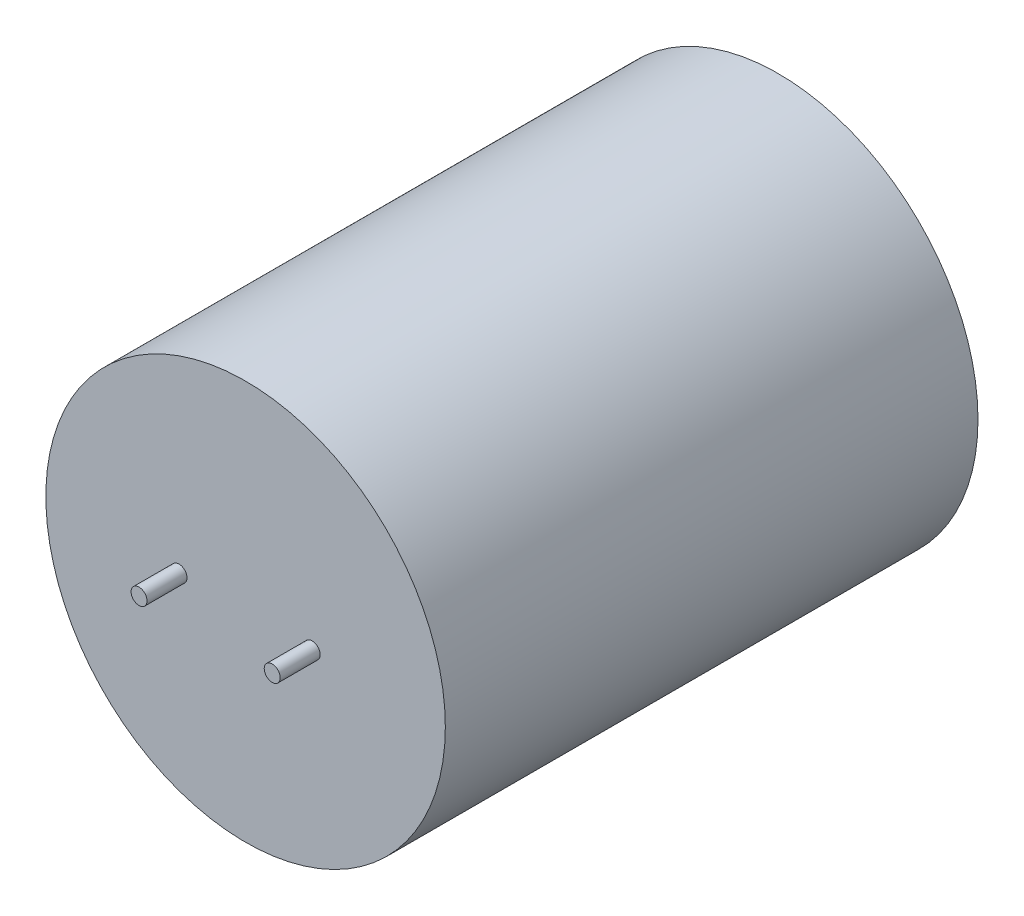
ISO-10303-21;
HEADER;
FILE_DESCRIPTION(('STEP AP214'),'2;1');
FILE_NAME('part.step','',(''),(''),'','','');
FILE_SCHEMA(('AUTOMOTIVE_DESIGN { 1 0 10303 214 1 1 1 1 }'));
ENDSEC;
DATA;
#1=APPLICATION_CONTEXT('core data for automotive mechanical design processes');
#2=APPLICATION_PROTOCOL_DEFINITION('international standard','automotive_design',2000,#1);
#3=PRODUCT_CONTEXT('',#1,'mechanical');
#4=PRODUCT('Part','Part','',(#3));
#5=PRODUCT_RELATED_PRODUCT_CATEGORY('part','',(#4));
#6=PRODUCT_DEFINITION_FORMATION('','',#4);
#7=PRODUCT_DEFINITION_CONTEXT('part definition',#1,'design');
#8=PRODUCT_DEFINITION('design','',#6,#7);
#9=PRODUCT_DEFINITION_SHAPE('','',#8);
#10=(LENGTH_UNIT() NAMED_UNIT(*) SI_UNIT(.MILLI.,.METRE.));
#11=(NAMED_UNIT(*) PLANE_ANGLE_UNIT() SI_UNIT($,.RADIAN.));
#12=(NAMED_UNIT(*) SI_UNIT($,.STERADIAN.) SOLID_ANGLE_UNIT());
#13=UNCERTAINTY_MEASURE_WITH_UNIT(LENGTH_MEASURE(1.E-05),#10,'distance_accuracy_value','');
#14=(GEOMETRIC_REPRESENTATION_CONTEXT(3) GLOBAL_UNCERTAINTY_ASSIGNED_CONTEXT((#13)) GLOBAL_UNIT_ASSIGNED_CONTEXT((#10,
#11,#12)) REPRESENTATION_CONTEXT('',''));
#15=CARTESIAN_POINT('',(0.,0.,0.));
#16=DIRECTION('',(0.,0.,1.));
#17=DIRECTION('',(1.,0.,0.));
#18=AXIS2_PLACEMENT_3D('',#15,#16,#17);
#19=CARTESIAN_POINT('',(0.,0.,40.));
#20=DIRECTION('',(0.,0.,1.));
#21=DIRECTION('',(1.,0.,0.));
#22=AXIS2_PLACEMENT_3D('',#19,#20,#21);
#23=PLANE('',#22);
#24=CARTESIAN_POINT('',(-5.,0.,40.));
#25=DIRECTION('',(0.,0.,1.));
#26=DIRECTION('',(1.,0.,0.));
#27=AXIS2_PLACEMENT_3D('',#24,#25,#26);
#28=CIRCLE('',#27,0.6);
#29=CARTESIAN_POINT('',(-4.4,0.,40.));
#30=VERTEX_POINT('',#29);
#31=EDGE_CURVE('E42',#30,#30,#28,.T.);
#32=ORIENTED_EDGE('',*,*,#31,.F.);
#33=EDGE_LOOP('',(#32));
#34=FACE_BOUND('',#33,.T.);
#35=CARTESIAN_POINT('',(0.,0.,40.));
#36=DIRECTION('',(0.,0.,1.));
#37=DIRECTION('',(1.,0.,0.));
#38=AXIS2_PLACEMENT_3D('',#35,#36,#37);
#39=CIRCLE('',#38,15.);
#40=CARTESIAN_POINT('',(15.,0.,40.));
#41=VERTEX_POINT('',#40);
#42=EDGE_CURVE('E10',#41,#41,#39,.T.);
#43=ORIENTED_EDGE('',*,*,#42,.T.);
#44=EDGE_LOOP('',(#43));
#45=FACE_BOUND('',#44,.T.);
#46=CARTESIAN_POINT('',(5.,0.,40.));
#47=DIRECTION('',(0.,0.,1.));
#48=DIRECTION('',(1.,0.,0.));
#49=AXIS2_PLACEMENT_3D('',#46,#47,#48);
#50=CIRCLE('',#49,0.6);
#51=CARTESIAN_POINT('',(5.6,0.,40.));
#52=VERTEX_POINT('',#51);
#53=EDGE_CURVE('E50',#52,#52,#50,.T.);
#54=ORIENTED_EDGE('',*,*,#53,.F.);
#55=EDGE_LOOP('',(#54));
#56=FACE_BOUND('',#55,.T.);
#57=ADVANCED_FACE('F27',(#34,#45,#56),#23,.T.);
#58=CARTESIAN_POINT('',(0.,0.,40.));
#59=DIRECTION('',(0.,0.,-1.));
#60=DIRECTION('',(-1.,0.,0.));
#61=AXIS2_PLACEMENT_3D('',#58,#59,#60);
#62=CYLINDRICAL_SURFACE('',#61,15.);
#63=ORIENTED_EDGE('',*,*,#42,.F.);
#64=EDGE_LOOP('',(#63));
#65=FACE_BOUND('',#64,.T.);
#66=CARTESIAN_POINT('',(0.,0.,0.));
#67=DIRECTION('',(0.,0.,1.));
#68=DIRECTION('',(1.,0.,0.));
#69=AXIS2_PLACEMENT_3D('',#66,#67,#68);
#70=CIRCLE('',#69,15.);
#71=CARTESIAN_POINT('',(15.,0.,0.));
#72=VERTEX_POINT('',#71);
#73=EDGE_CURVE('E34',#72,#72,#70,.T.);
#74=ORIENTED_EDGE('',*,*,#73,.T.);
#75=EDGE_LOOP('',(#74));
#76=FACE_BOUND('',#75,.T.);
#77=ADVANCED_FACE('F29',(#65,#76),#62,.T.);
#78=CARTESIAN_POINT('',(0.,0.,0.));
#79=DIRECTION('',(0.,0.,1.));
#80=DIRECTION('',(1.,0.,0.));
#81=AXIS2_PLACEMENT_3D('',#78,#79,#80);
#82=PLANE('',#81);
#83=ORIENTED_EDGE('',*,*,#73,.F.);
#84=EDGE_LOOP('',(#83));
#85=FACE_BOUND('',#84,.T.);
#86=ADVANCED_FACE('F61',(#85),#82,.F.);
#87=CARTESIAN_POINT('',(-5.,0.,43.));
#88=DIRECTION('',(0.,0.,-1.));
#89=DIRECTION('',(-1.,0.,0.));
#90=AXIS2_PLACEMENT_3D('',#87,#88,#89);
#91=CYLINDRICAL_SURFACE('',#90,0.6);
#92=CARTESIAN_POINT('',(-5.,0.,43.));
#93=DIRECTION('',(0.,0.,1.));
#94=DIRECTION('',(1.,0.,0.));
#95=AXIS2_PLACEMENT_3D('',#92,#93,#94);
#96=CIRCLE('',#95,0.6);
#97=CARTESIAN_POINT('',(-4.4,0.,43.));
#98=VERTEX_POINT('',#97);
#99=EDGE_CURVE('E38',#98,#98,#96,.T.);
#100=ORIENTED_EDGE('',*,*,#99,.F.);
#101=EDGE_LOOP('',(#100));
#102=FACE_BOUND('',#101,.T.);
#103=ORIENTED_EDGE('',*,*,#31,.T.);
#104=EDGE_LOOP('',(#103));
#105=FACE_BOUND('',#104,.T.);
#106=ADVANCED_FACE('F67',(#102,#105),#91,.T.);
#107=CARTESIAN_POINT('',(-5.,0.,43.));
#108=DIRECTION('',(0.,0.,1.));
#109=DIRECTION('',(1.,0.,0.));
#110=AXIS2_PLACEMENT_3D('',#107,#108,#109);
#111=PLANE('',#110);
#112=ORIENTED_EDGE('',*,*,#99,.T.);
#113=EDGE_LOOP('',(#112));
#114=FACE_BOUND('',#113,.T.);
#115=ADVANCED_FACE('F71',(#114),#111,.T.);
#116=CARTESIAN_POINT('',(5.,0.,43.));
#117=DIRECTION('',(0.,0.,-1.));
#118=DIRECTION('',(-1.,0.,0.));
#119=AXIS2_PLACEMENT_3D('',#116,#117,#118);
#120=CYLINDRICAL_SURFACE('',#119,0.6);
#121=CARTESIAN_POINT('',(5.,0.,43.));
#122=DIRECTION('',(0.,0.,1.));
#123=DIRECTION('',(1.,0.,0.));
#124=AXIS2_PLACEMENT_3D('',#121,#122,#123);
#125=CIRCLE('',#124,0.6);
#126=CARTESIAN_POINT('',(5.6,0.,43.));
#127=VERTEX_POINT('',#126);
#128=EDGE_CURVE('E47',#127,#127,#125,.T.);
#129=ORIENTED_EDGE('',*,*,#128,.F.);
#130=EDGE_LOOP('',(#129));
#131=FACE_BOUND('',#130,.T.);
#132=ORIENTED_EDGE('',*,*,#53,.T.);
#133=EDGE_LOOP('',(#132));
#134=FACE_BOUND('',#133,.T.);
#135=ADVANCED_FACE('F54',(#131,#134),#120,.T.);
#136=CARTESIAN_POINT('',(5.,0.,43.));
#137=DIRECTION('',(0.,0.,1.));
#138=DIRECTION('',(1.,0.,0.));
#139=AXIS2_PLACEMENT_3D('',#136,#137,#138);
#140=PLANE('',#139);
#141=ORIENTED_EDGE('',*,*,#128,.T.);
#142=EDGE_LOOP('',(#141));
#143=FACE_BOUND('',#142,.T.);
#144=ADVANCED_FACE('F78',(#143),#140,.T.);
#145=CLOSED_SHELL('',(#57,#77,#86,#106,#115,#135,#144));
#146=MANIFOLD_SOLID_BREP('B2',#145);
#147=ADVANCED_BREP_SHAPE_REPRESENTATION('',(#18,#146),#14);
#148=SHAPE_DEFINITION_REPRESENTATION(#9,#147);
ENDSEC;
END-ISO-10303-21;
